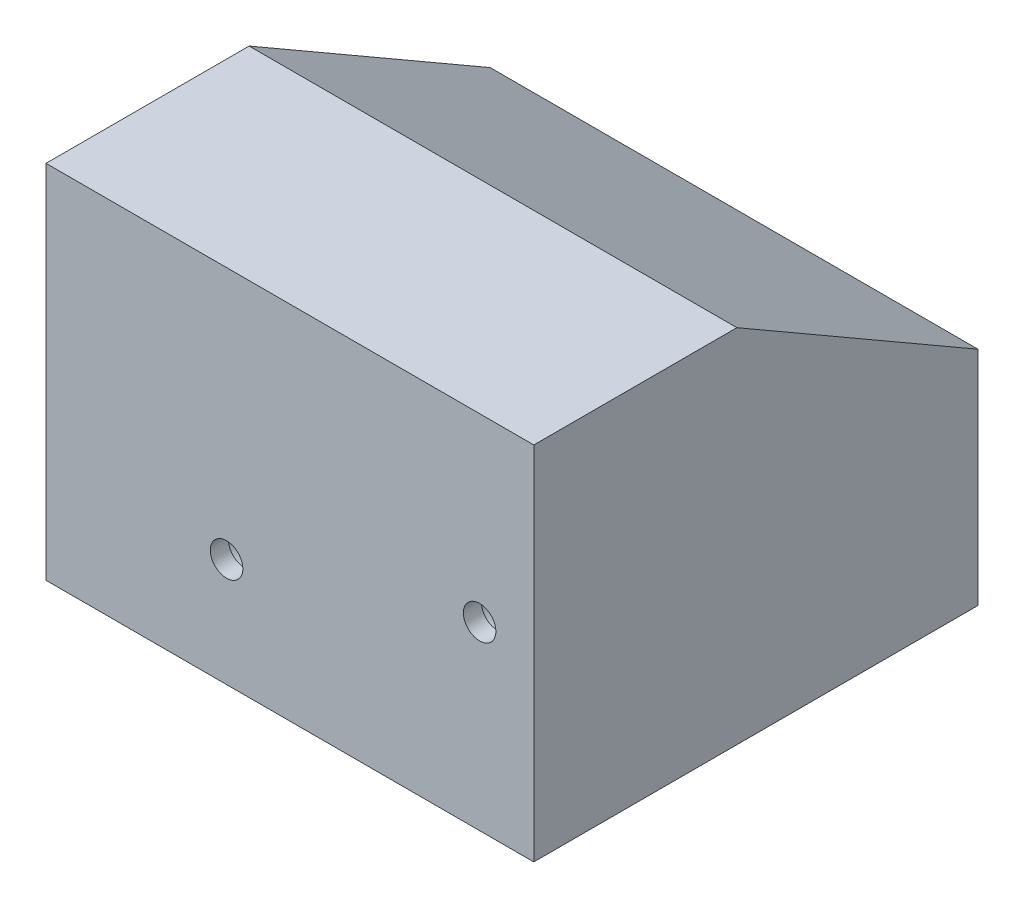
ISO-10303-21;
HEADER;
FILE_DESCRIPTION(('STEP AP214'),'2;1');
FILE_NAME('part.step','',(''),(''),'','','');
FILE_SCHEMA(('AUTOMOTIVE_DESIGN { 1 0 10303 214 1 1 1 1 }'));
ENDSEC;
DATA;
#1=APPLICATION_CONTEXT('core data for automotive mechanical design processes');
#2=APPLICATION_PROTOCOL_DEFINITION('international standard','automotive_design',2000,#1);
#3=PRODUCT_CONTEXT('',#1,'mechanical');
#4=PRODUCT('Part','Part','',(#3));
#5=PRODUCT_RELATED_PRODUCT_CATEGORY('part','',(#4));
#6=PRODUCT_DEFINITION_FORMATION('','',#4);
#7=PRODUCT_DEFINITION_CONTEXT('part definition',#1,'design');
#8=PRODUCT_DEFINITION('design','',#6,#7);
#9=PRODUCT_DEFINITION_SHAPE('','',#8);
#10=(LENGTH_UNIT() NAMED_UNIT(*) SI_UNIT(.MILLI.,.METRE.));
#11=(NAMED_UNIT(*) PLANE_ANGLE_UNIT() SI_UNIT($,.RADIAN.));
#12=(NAMED_UNIT(*) SI_UNIT($,.STERADIAN.) SOLID_ANGLE_UNIT());
#13=UNCERTAINTY_MEASURE_WITH_UNIT(LENGTH_MEASURE(1.E-05),#10,'distance_accuracy_value','');
#14=(GEOMETRIC_REPRESENTATION_CONTEXT(3) GLOBAL_UNCERTAINTY_ASSIGNED_CONTEXT((#13)) GLOBAL_UNIT_ASSIGNED_CONTEXT((#10,
#11,#12)) REPRESENTATION_CONTEXT('',''));
#15=CARTESIAN_POINT('',(0.,0.,0.));
#16=DIRECTION('',(0.,0.,1.));
#17=DIRECTION('',(1.,0.,0.));
#18=AXIS2_PLACEMENT_3D('',#15,#16,#17);
#19=CARTESIAN_POINT('',(-67.5347222222222,-50.,123.));
#20=DIRECTION('',(1.,0.,0.));
#21=DIRECTION('',(0.,0.,-1.));
#22=AXIS2_PLACEMENT_3D('',#19,#20,#21);
#23=PLANE('',#22);
#24=DIRECTION('',(0.,0.,-1.));
#25=VECTOR('',#24,1.);
#26=CARTESIAN_POINT('',(-67.5347222222222,50.,123.));
#27=LINE('',#26,#25);
#28=CARTESIAN_POINT('',(-67.5347222222222,50.,123.));
#29=VERTEX_POINT('',#28);
#30=CARTESIAN_POINT('',(-67.5347222222222,50.,66.7561248750507));
#31=VERTEX_POINT('',#30);
#32=EDGE_CURVE('E103',#29,#31,#27,.T.);
#33=ORIENTED_EDGE('',*,*,#32,.T.);
#34=DIRECTION('',(0.,0.499999999999995,0.866025403784442));
#35=VECTOR('',#34,1.);
#36=CARTESIAN_POINT('',(-67.5347222222222,11.4583333333338,0.));
#37=LINE('',#36,#35);
#38=CARTESIAN_POINT('',(-67.5347222222222,11.4583333333338,0.));
#39=VERTEX_POINT('',#38);
#40=EDGE_CURVE('E86',#39,#31,#37,.T.);
#41=ORIENTED_EDGE('',*,*,#40,.F.);
#42=DIRECTION('',(0.,-1.,0.));
#43=VECTOR('',#42,1.);
#44=CARTESIAN_POINT('',(-67.5347222222222,-50.,0.));
#45=LINE('',#44,#43);
#46=CARTESIAN_POINT('',(-67.5347222222222,-50.,0.));
#47=VERTEX_POINT('',#46);
#48=EDGE_CURVE('E90',#39,#47,#45,.T.);
#49=ORIENTED_EDGE('',*,*,#48,.T.);
#50=DIRECTION('',(0.,0.,-1.));
#51=VECTOR('',#50,1.);
#52=CARTESIAN_POINT('',(-67.5347222222222,-50.,123.));
#53=LINE('',#52,#51);
#54=CARTESIAN_POINT('',(-67.5347222222222,-50.,123.));
#55=VERTEX_POINT('',#54);
#56=EDGE_CURVE('E11',#55,#47,#53,.T.);
#57=ORIENTED_EDGE('',*,*,#56,.F.);
#58=DIRECTION('',(0.,-1.,0.));
#59=VECTOR('',#58,1.);
#60=CARTESIAN_POINT('',(-67.5347222222222,-50.,123.));
#61=LINE('',#60,#59);
#62=EDGE_CURVE('E108',#29,#55,#61,.T.);
#63=ORIENTED_EDGE('',*,*,#62,.F.);
#64=EDGE_LOOP('',(#33,#41,#49,#57,#63));
#65=FACE_BOUND('',#64,.T.);
#66=ADVANCED_FACE('F32',(#65),#23,.F.);
#67=CARTESIAN_POINT('',(67.5347222222222,-50.,123.));
#68=DIRECTION('',(0.,1.,0.));
#69=DIRECTION('',(-1.,0.,0.));
#70=AXIS2_PLACEMENT_3D('',#67,#68,#69);
#71=PLANE('',#70);
#72=DIRECTION('',(1.,0.,0.));
#73=VECTOR('',#72,1.);
#74=CARTESIAN_POINT('',(67.5347222222222,-50.,0.));
#75=LINE('',#74,#73);
#76=CARTESIAN_POINT('',(67.5347222222222,-50.,0.));
#77=VERTEX_POINT('',#76);
#78=EDGE_CURVE('E70',#47,#77,#75,.T.);
#79=ORIENTED_EDGE('',*,*,#78,.T.);
#80=DIRECTION('',(0.,0.,-1.));
#81=VECTOR('',#80,1.);
#82=CARTESIAN_POINT('',(67.5347222222222,-50.,123.));
#83=LINE('',#82,#81);
#84=CARTESIAN_POINT('',(67.5347222222222,-50.,123.));
#85=VERTEX_POINT('',#84);
#86=EDGE_CURVE('E39',#85,#77,#83,.T.);
#87=ORIENTED_EDGE('',*,*,#86,.F.);
#88=DIRECTION('',(1.,0.,0.));
#89=VECTOR('',#88,1.);
#90=CARTESIAN_POINT('',(67.5347222222222,-50.,123.));
#91=LINE('',#90,#89);
#92=EDGE_CURVE('E75',#55,#85,#91,.T.);
#93=ORIENTED_EDGE('',*,*,#92,.F.);
#94=ORIENTED_EDGE('',*,*,#56,.T.);
#95=EDGE_LOOP('',(#79,#87,#93,#94));
#96=FACE_BOUND('',#95,.T.);
#97=ADVANCED_FACE('F156',(#96),#71,.F.);
#98=CARTESIAN_POINT('',(67.5347222222222,-50.,123.));
#99=DIRECTION('',(-1.,0.,0.));
#100=DIRECTION('',(0.,0.,1.));
#101=AXIS2_PLACEMENT_3D('',#98,#99,#100);
#102=PLANE('',#101);
#103=DIRECTION('',(0.,1.,0.));
#104=VECTOR('',#103,1.);
#105=CARTESIAN_POINT('',(67.5347222222222,-50.,0.));
#106=LINE('',#105,#104);
#107=CARTESIAN_POINT('',(67.5347222222222,11.4583333333338,0.));
#108=VERTEX_POINT('',#107);
#109=EDGE_CURVE('E100',#77,#108,#106,.T.);
#110=ORIENTED_EDGE('',*,*,#109,.T.);
#111=DIRECTION('',(0.,0.499999999999995,0.866025403784442));
#112=VECTOR('',#111,1.);
#113=CARTESIAN_POINT('',(67.5347222222222,11.4583333333338,0.));
#114=LINE('',#113,#112);
#115=CARTESIAN_POINT('',(67.5347222222222,50.,66.7561248750507));
#116=VERTEX_POINT('',#115);
#117=EDGE_CURVE('E46',#108,#116,#114,.T.);
#118=ORIENTED_EDGE('',*,*,#117,.T.);
#119=DIRECTION('',(0.,0.,-1.));
#120=VECTOR('',#119,1.);
#121=CARTESIAN_POINT('',(67.5347222222222,50.,123.));
#122=LINE('',#121,#120);
#123=CARTESIAN_POINT('',(67.5347222222222,50.,123.));
#124=VERTEX_POINT('',#123);
#125=EDGE_CURVE('E98',#124,#116,#122,.T.);
#126=ORIENTED_EDGE('',*,*,#125,.F.);
#127=DIRECTION('',(0.,1.,0.));
#128=VECTOR('',#127,1.);
#129=CARTESIAN_POINT('',(67.5347222222222,-50.,123.));
#130=LINE('',#129,#128);
#131=EDGE_CURVE('E112',#85,#124,#130,.T.);
#132=ORIENTED_EDGE('',*,*,#131,.F.);
#133=ORIENTED_EDGE('',*,*,#86,.T.);
#134=EDGE_LOOP('',(#110,#118,#126,#132,#133));
#135=FACE_BOUND('',#134,.T.);
#136=ADVANCED_FACE('F96',(#135),#102,.F.);
#137=CARTESIAN_POINT('',(67.5347222222222,50.,123.));
#138=DIRECTION('',(0.,-1.,0.));
#139=DIRECTION('',(1.,0.,0.));
#140=AXIS2_PLACEMENT_3D('',#137,#138,#139);
#141=PLANE('',#140);
#142=ORIENTED_EDGE('',*,*,#125,.T.);
#143=DIRECTION('',(-1.,0.,0.));
#144=VECTOR('',#143,1.);
#145=CARTESIAN_POINT('',(67.5347222222222,50.,66.7561248750507));
#146=LINE('',#145,#144);
#147=EDGE_CURVE('E83',#116,#31,#146,.T.);
#148=ORIENTED_EDGE('',*,*,#147,.T.);
#149=ORIENTED_EDGE('',*,*,#32,.F.);
#150=DIRECTION('',(-1.,0.,0.));
#151=VECTOR('',#150,1.);
#152=CARTESIAN_POINT('',(67.5347222222222,50.,123.));
#153=LINE('',#152,#151);
#154=EDGE_CURVE('E55',#124,#29,#153,.T.);
#155=ORIENTED_EDGE('',*,*,#154,.F.);
#156=EDGE_LOOP('',(#142,#148,#149,#155));
#157=FACE_BOUND('',#156,.T.);
#158=ADVANCED_FACE('F102',(#157),#141,.F.);
#159=CARTESIAN_POINT('',(0.,0.,123.));
#160=DIRECTION('',(0.,0.,1.));
#161=DIRECTION('',(1.,0.,0.));
#162=AXIS2_PLACEMENT_3D('',#159,#160,#161);
#163=PLANE('',#162);
#164=CARTESIAN_POINT('',(52.5347222222222,0.,123.));
#165=DIRECTION('',(0.,0.,-1.));
#166=DIRECTION('',(-1.,0.,0.));
#167=AXIS2_PLACEMENT_3D('',#164,#165,#166);
#168=CIRCLE('',#167,4.49999999999997);
#169=CARTESIAN_POINT('',(48.0347222222223,0.,123.));
#170=VERTEX_POINT('',#169);
#171=EDGE_CURVE('E130',#170,#170,#168,.T.);
#172=ORIENTED_EDGE('',*,*,#171,.T.);
#173=EDGE_LOOP('',(#172));
#174=FACE_BOUND('',#173,.T.);
#175=CARTESIAN_POINT('',(-17.5347222222222,-20.,123.));
#176=DIRECTION('',(0.,0.,-1.));
#177=DIRECTION('',(-1.,0.,0.));
#178=AXIS2_PLACEMENT_3D('',#175,#176,#177);
#179=CIRCLE('',#178,4.49999999999997);
#180=CARTESIAN_POINT('',(-22.0347222222222,-20.,123.));
#181=VERTEX_POINT('',#180);
#182=EDGE_CURVE('E117',#181,#181,#179,.T.);
#183=ORIENTED_EDGE('',*,*,#182,.T.);
#184=EDGE_LOOP('',(#183));
#185=FACE_BOUND('',#184,.T.);
#186=ORIENTED_EDGE('',*,*,#62,.T.);
#187=ORIENTED_EDGE('',*,*,#92,.T.);
#188=ORIENTED_EDGE('',*,*,#131,.T.);
#189=ORIENTED_EDGE('',*,*,#154,.T.);
#190=EDGE_LOOP('',(#186,#187,#188,#189));
#191=FACE_BOUND('',#190,.T.);
#192=ADVANCED_FACE('F148',(#174,#185,#191),#163,.T.);
#193=CARTESIAN_POINT('',(0.,0.,0.));
#194=DIRECTION('',(0.,0.,1.));
#195=DIRECTION('',(1.,0.,0.));
#196=AXIS2_PLACEMENT_3D('',#193,#194,#195);
#197=PLANE('',#196);
#198=CARTESIAN_POINT('',(52.5347222222222,0.,0.));
#199=DIRECTION('',(0.,0.,-1.));
#200=DIRECTION('',(-1.,0.,0.));
#201=AXIS2_PLACEMENT_3D('',#198,#199,#200);
#202=CIRCLE('',#201,7.49999999999999);
#203=CARTESIAN_POINT('',(45.0347222222222,0.,0.));
#204=VERTEX_POINT('',#203);
#205=EDGE_CURVE('E139',#204,#204,#202,.T.);
#206=ORIENTED_EDGE('',*,*,#205,.F.);
#207=EDGE_LOOP('',(#206));
#208=FACE_BOUND('',#207,.T.);
#209=CARTESIAN_POINT('',(-17.5347222222222,-20.,0.));
#210=DIRECTION('',(0.,0.,-1.));
#211=DIRECTION('',(-1.,0.,0.));
#212=AXIS2_PLACEMENT_3D('',#209,#210,#211);
#213=CIRCLE('',#212,7.5);
#214=CARTESIAN_POINT('',(-25.0347222222222,-20.,0.));
#215=VERTEX_POINT('',#214);
#216=EDGE_CURVE('E127',#215,#215,#213,.T.);
#217=ORIENTED_EDGE('',*,*,#216,.F.);
#218=EDGE_LOOP('',(#217));
#219=FACE_BOUND('',#218,.T.);
#220=ORIENTED_EDGE('',*,*,#48,.F.);
#221=DIRECTION('',(-1.,0.,0.));
#222=VECTOR('',#221,1.);
#223=CARTESIAN_POINT('',(67.5347222222222,11.4583333333338,0.));
#224=LINE('',#223,#222);
#225=EDGE_CURVE('E91',#108,#39,#224,.T.);
#226=ORIENTED_EDGE('',*,*,#225,.F.);
#227=ORIENTED_EDGE('',*,*,#109,.F.);
#228=ORIENTED_EDGE('',*,*,#78,.F.);
#229=EDGE_LOOP('',(#220,#226,#227,#228));
#230=FACE_BOUND('',#229,.T.);
#231=ADVANCED_FACE('F145',(#208,#219,#230),#197,.F.);
#232=CARTESIAN_POINT('',(67.5347222222222,11.4583333333338,0.));
#233=DIRECTION('',(0.,-0.866025403784442,0.499999999999995));
#234=DIRECTION('',(0.,-0.499999999999995,-0.866025403784442));
#235=AXIS2_PLACEMENT_3D('',#232,#233,#234);
#236=PLANE('',#235);
#237=ORIENTED_EDGE('',*,*,#40,.T.);
#238=ORIENTED_EDGE('',*,*,#147,.F.);
#239=ORIENTED_EDGE('',*,*,#117,.F.);
#240=ORIENTED_EDGE('',*,*,#225,.T.);
#241=EDGE_LOOP('',(#237,#238,#239,#240));
#242=FACE_BOUND('',#241,.T.);
#243=ADVANCED_FACE('F84',(#242),#236,.F.);
#244=CARTESIAN_POINT('',(-17.5347222222222,-20.,0.));
#245=DIRECTION('',(0.,0.,-1.));
#246=DIRECTION('',(-1.,0.,0.));
#247=AXIS2_PLACEMENT_3D('',#244,#245,#246);
#248=CYLINDRICAL_SURFACE('',#247,4.49999999999997);
#249=ORIENTED_EDGE('',*,*,#182,.F.);
#250=EDGE_LOOP('',(#249));
#251=FACE_BOUND('',#250,.T.);
#252=CARTESIAN_POINT('',(-17.5347222222222,-20.,118.));
#253=DIRECTION('',(0.,0.,-1.));
#254=DIRECTION('',(-1.,0.,0.));
#255=AXIS2_PLACEMENT_3D('',#252,#253,#254);
#256=CIRCLE('',#255,4.49999999999997);
#257=CARTESIAN_POINT('',(-22.0347222222222,-20.,118.));
#258=VERTEX_POINT('',#257);
#259=EDGE_CURVE('E121',#258,#258,#256,.T.);
#260=ORIENTED_EDGE('',*,*,#259,.T.);
#261=EDGE_LOOP('',(#260));
#262=FACE_BOUND('',#261,.T.);
#263=ADVANCED_FACE('F171',(#251,#262),#248,.F.);
#264=CARTESIAN_POINT('',(-13.0347222222223,-20.,118.));
#265=DIRECTION('',(0.,0.,1.));
#266=DIRECTION('',(1.,0.,0.));
#267=AXIS2_PLACEMENT_3D('',#264,#265,#266);
#268=PLANE('',#267);
#269=ORIENTED_EDGE('',*,*,#259,.F.);
#270=EDGE_LOOP('',(#269));
#271=FACE_BOUND('',#270,.T.);
#272=CARTESIAN_POINT('',(-17.5347222222222,-20.,118.));
#273=DIRECTION('',(0.,0.,-1.));
#274=DIRECTION('',(-1.,0.,0.));
#275=AXIS2_PLACEMENT_3D('',#272,#273,#274);
#276=CIRCLE('',#275,7.49999999999998);
#277=CARTESIAN_POINT('',(-25.0347222222222,-20.,118.));
#278=VERTEX_POINT('',#277);
#279=EDGE_CURVE('E124',#278,#278,#276,.T.);
#280=ORIENTED_EDGE('',*,*,#279,.T.);
#281=EDGE_LOOP('',(#280));
#282=FACE_BOUND('',#281,.T.);
#283=ADVANCED_FACE('F174',(#271,#282),#268,.F.);
#284=CARTESIAN_POINT('',(-17.5347222222222,-20.,0.));
#285=DIRECTION('',(0.,0.,-1.));
#286=DIRECTION('',(-1.,0.,0.));
#287=AXIS2_PLACEMENT_3D('',#284,#285,#286);
#288=CYLINDRICAL_SURFACE('',#287,7.49999999999999);
#289=ORIENTED_EDGE('',*,*,#279,.F.);
#290=EDGE_LOOP('',(#289));
#291=FACE_BOUND('',#290,.T.);
#292=ORIENTED_EDGE('',*,*,#216,.T.);
#293=EDGE_LOOP('',(#292));
#294=FACE_BOUND('',#293,.T.);
#295=ADVANCED_FACE('F178',(#291,#294),#288,.F.);
#296=CARTESIAN_POINT('',(52.5347222222222,0.,0.));
#297=DIRECTION('',(0.,0.,-1.));
#298=DIRECTION('',(-1.,0.,0.));
#299=AXIS2_PLACEMENT_3D('',#296,#297,#298);
#300=CYLINDRICAL_SURFACE('',#299,4.49999999999997);
#301=ORIENTED_EDGE('',*,*,#171,.F.);
#302=EDGE_LOOP('',(#301));
#303=FACE_BOUND('',#302,.T.);
#304=CARTESIAN_POINT('',(52.5347222222222,0.,118.));
#305=DIRECTION('',(0.,0.,-1.));
#306=DIRECTION('',(-1.,0.,0.));
#307=AXIS2_PLACEMENT_3D('',#304,#305,#306);
#308=CIRCLE('',#307,4.49999999999997);
#309=CARTESIAN_POINT('',(48.0347222222223,0.,118.));
#310=VERTEX_POINT('',#309);
#311=EDGE_CURVE('E133',#310,#310,#308,.T.);
#312=ORIENTED_EDGE('',*,*,#311,.T.);
#313=EDGE_LOOP('',(#312));
#314=FACE_BOUND('',#313,.T.);
#315=ADVANCED_FACE('F182',(#303,#314),#300,.F.);
#316=CARTESIAN_POINT('',(57.0347222222222,0.,118.));
#317=DIRECTION('',(0.,0.,1.));
#318=DIRECTION('',(1.,0.,0.));
#319=AXIS2_PLACEMENT_3D('',#316,#317,#318);
#320=PLANE('',#319);
#321=ORIENTED_EDGE('',*,*,#311,.F.);
#322=EDGE_LOOP('',(#321));
#323=FACE_BOUND('',#322,.T.);
#324=CARTESIAN_POINT('',(52.5347222222222,0.,118.));
#325=DIRECTION('',(0.,0.,-1.));
#326=DIRECTION('',(-1.,0.,0.));
#327=AXIS2_PLACEMENT_3D('',#324,#325,#326);
#328=CIRCLE('',#327,7.49999999999998);
#329=CARTESIAN_POINT('',(45.0347222222223,0.,118.));
#330=VERTEX_POINT('',#329);
#331=EDGE_CURVE('E136',#330,#330,#328,.T.);
#332=ORIENTED_EDGE('',*,*,#331,.T.);
#333=EDGE_LOOP('',(#332));
#334=FACE_BOUND('',#333,.T.);
#335=ADVANCED_FACE('F186',(#323,#334),#320,.F.);
#336=CARTESIAN_POINT('',(52.5347222222222,0.,0.));
#337=DIRECTION('',(0.,0.,-1.));
#338=DIRECTION('',(-1.,0.,0.));
#339=AXIS2_PLACEMENT_3D('',#336,#337,#338);
#340=CYLINDRICAL_SURFACE('',#339,7.49999999999999);
#341=ORIENTED_EDGE('',*,*,#331,.F.);
#342=EDGE_LOOP('',(#341));
#343=FACE_BOUND('',#342,.T.);
#344=ORIENTED_EDGE('',*,*,#205,.T.);
#345=EDGE_LOOP('',(#344));
#346=FACE_BOUND('',#345,.T.);
#347=ADVANCED_FACE('F143',(#343,#346),#340,.F.);
#348=CLOSED_SHELL('',(#66,#97,#136,#158,#192,#231,#243,#263,#283,#295,#315,#335,#347));
#349=MANIFOLD_SOLID_BREP('B2',#348);
#350=ADVANCED_BREP_SHAPE_REPRESENTATION('',(#18,#349),#14);
#351=SHAPE_DEFINITION_REPRESENTATION(#9,#350);
ENDSEC;
END-ISO-10303-21;
